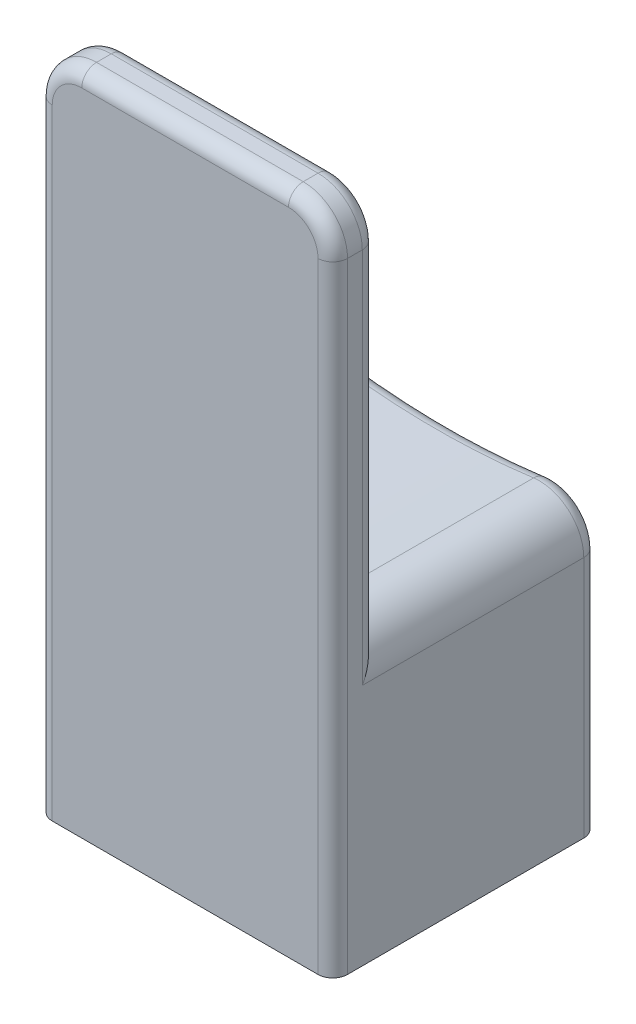
ISO-10303-21;
HEADER;
FILE_DESCRIPTION(('STEP AP214'),'2;1');
FILE_NAME('part.step','',(''),(''),'','','');
FILE_SCHEMA(('AUTOMOTIVE_DESIGN { 1 0 10303 214 1 1 1 1 }'));
ENDSEC;
DATA;
#1=APPLICATION_CONTEXT('core data for automotive mechanical design processes');
#2=APPLICATION_PROTOCOL_DEFINITION('international standard','automotive_design',2000,#1);
#3=PRODUCT_CONTEXT('',#1,'mechanical');
#4=PRODUCT('Part','Part','',(#3));
#5=PRODUCT_RELATED_PRODUCT_CATEGORY('part','',(#4));
#6=PRODUCT_DEFINITION_FORMATION('','',#4);
#7=PRODUCT_DEFINITION_CONTEXT('part definition',#1,'design');
#8=PRODUCT_DEFINITION('design','',#6,#7);
#9=PRODUCT_DEFINITION_SHAPE('','',#8);
#10=(LENGTH_UNIT() NAMED_UNIT(*) SI_UNIT(.MILLI.,.METRE.));
#11=(NAMED_UNIT(*) PLANE_ANGLE_UNIT() SI_UNIT($,.RADIAN.));
#12=(NAMED_UNIT(*) SI_UNIT($,.STERADIAN.) SOLID_ANGLE_UNIT());
#13=UNCERTAINTY_MEASURE_WITH_UNIT(LENGTH_MEASURE(1.E-05),#10,'distance_accuracy_value','');
#14=(GEOMETRIC_REPRESENTATION_CONTEXT(3) GLOBAL_UNCERTAINTY_ASSIGNED_CONTEXT((#13)) GLOBAL_UNIT_ASSIGNED_CONTEXT((#10,
#11,#12)) REPRESENTATION_CONTEXT('',''));
#15=CARTESIAN_POINT('',(0.,0.,0.));
#16=DIRECTION('',(0.,0.,1.));
#17=DIRECTION('',(1.,0.,0.));
#18=AXIS2_PLACEMENT_3D('',#15,#16,#17);
#19=CARTESIAN_POINT('',(0.,3.5,0.));
#20=DIRECTION('',(0.,-1.,0.));
#21=DIRECTION('',(0.,0.,-1.));
#22=AXIS2_PLACEMENT_3D('',#19,#20,#21);
#23=CYLINDRICAL_SURFACE('',#22,3.9);
#24=CARTESIAN_POINT('',(0.,3.5,0.));
#25=DIRECTION('',(0.,1.,0.));
#26=DIRECTION('',(0.,0.,1.));
#27=AXIS2_PLACEMENT_3D('',#24,#25,#26);
#28=CIRCLE('',#27,3.9);
#29=CARTESIAN_POINT('',(0.,3.5,3.9));
#30=VERTEX_POINT('',#29);
#31=EDGE_CURVE('E194',#30,#30,#28,.T.);
#32=ORIENTED_EDGE('',*,*,#31,.F.);
#33=EDGE_LOOP('',(#32));
#34=FACE_BOUND('',#33,.T.);
#35=CARTESIAN_POINT('',(0.,0.,0.));
#36=DIRECTION('',(0.,1.,0.));
#37=DIRECTION('',(0.,0.,1.));
#38=AXIS2_PLACEMENT_3D('',#35,#36,#37);
#39=CIRCLE('',#38,3.9);
#40=CARTESIAN_POINT('',(0.,0.,3.9));
#41=VERTEX_POINT('',#40);
#42=EDGE_CURVE('E197',#41,#41,#39,.T.);
#43=ORIENTED_EDGE('',*,*,#42,.T.);
#44=EDGE_LOOP('',(#43));
#45=FACE_BOUND('',#44,.T.);
#46=ADVANCED_FACE('F41',(#34,#45),#23,.T.);
#47=CARTESIAN_POINT('',(0.,0.,0.));
#48=DIRECTION('',(0.,1.,0.));
#49=DIRECTION('',(0.,0.,1.));
#50=AXIS2_PLACEMENT_3D('',#47,#48,#49);
#51=PLANE('',#50);
#52=ORIENTED_EDGE('',*,*,#42,.F.);
#53=EDGE_LOOP('',(#52));
#54=FACE_BOUND('',#53,.T.);
#55=ADVANCED_FACE('F325',(#54),#51,.F.);
#56=CARTESIAN_POINT('',(-10.,23.5,7.5));
#57=DIRECTION('',(1.,0.,0.));
#58=DIRECTION('',(0.,0.,-1.));
#59=AXIS2_PLACEMENT_3D('',#56,#57,#58);
#60=PLANE('',#59);
#61=DIRECTION('',(0.,0.,1.));
#62=VECTOR('',#61,1.);
#63=CARTESIAN_POINT('',(-10.,19.9540927094088,7.5));
#64=LINE('',#63,#62);
#65=CARTESIAN_POINT('',(-10.,19.9540927094088,8.5));
#66=VERTEX_POINT('',#65);
#67=CARTESIAN_POINT('',(-10.,19.9540927094088,-6.5));
#68=VERTEX_POINT('',#67);
#69=EDGE_CURVE('E203',#66,#68,#64,.F.);
#70=ORIENTED_EDGE('',*,*,#69,.T.);
#71=DIRECTION('',(0.,-1.,0.));
#72=VECTOR('',#71,1.);
#73=CARTESIAN_POINT('',(-10.,23.5,-6.5));
#74=LINE('',#73,#72);
#75=CARTESIAN_POINT('',(-10.,3.5,-6.5));
#76=VERTEX_POINT('',#75);
#77=EDGE_CURVE('E365',#68,#76,#74,.T.);
#78=ORIENTED_EDGE('',*,*,#77,.T.);
#79=DIRECTION('',(0.,0.,1.));
#80=VECTOR('',#79,1.);
#81=CARTESIAN_POINT('',(-10.,3.5,7.5));
#82=LINE('',#81,#80);
#83=CARTESIAN_POINT('',(-10.,3.5,9.5));
#84=VERTEX_POINT('',#83);
#85=EDGE_CURVE('E455',#76,#84,#82,.T.);
#86=ORIENTED_EDGE('',*,*,#85,.T.);
#87=DIRECTION('',(0.,-1.,0.));
#88=VECTOR('',#87,1.);
#89=CARTESIAN_POINT('',(-10.,23.5,9.5));
#90=LINE('',#89,#88);
#91=CARTESIAN_POINT('',(-10.,45.5,9.5));
#92=VERTEX_POINT('',#91);
#93=EDGE_CURVE('E248',#84,#92,#90,.F.);
#94=ORIENTED_EDGE('',*,*,#93,.T.);
#95=DIRECTION('',(0.,0.,-1.));
#96=VECTOR('',#95,1.);
#97=CARTESIAN_POINT('',(-10.,45.5,7.5));
#98=LINE('',#97,#96);
#99=CARTESIAN_POINT('',(-10.,45.5,8.5));
#100=VERTEX_POINT('',#99);
#101=EDGE_CURVE('E208',#92,#100,#98,.T.);
#102=ORIENTED_EDGE('',*,*,#101,.T.);
#103=DIRECTION('',(0.,-1.,0.));
#104=VECTOR('',#103,1.);
#105=CARTESIAN_POINT('',(-10.,19.9540927094088,8.5));
#106=LINE('',#105,#104);
#107=EDGE_CURVE('E245',#100,#66,#106,.T.);
#108=ORIENTED_EDGE('',*,*,#107,.T.);
#109=EDGE_LOOP('',(#70,#78,#86,#94,#102,#108));
#110=FACE_BOUND('',#109,.T.);
#111=ADVANCED_FACE('F331',(#110),#60,.F.);
#112=CARTESIAN_POINT('',(10.,23.5,7.5));
#113=DIRECTION('',(-1.,0.,0.));
#114=DIRECTION('',(0.,0.,1.));
#115=AXIS2_PLACEMENT_3D('',#112,#113,#114);
#116=PLANE('',#115);
#117=DIRECTION('',(0.,0.,-1.));
#118=VECTOR('',#117,1.);
#119=CARTESIAN_POINT('',(10.,3.5,7.5));
#120=LINE('',#119,#118);
#121=CARTESIAN_POINT('',(10.,3.5,9.5));
#122=VERTEX_POINT('',#121);
#123=CARTESIAN_POINT('',(10.,3.5,-6.5));
#124=VERTEX_POINT('',#123);
#125=EDGE_CURVE('E459',#122,#124,#120,.T.);
#126=ORIENTED_EDGE('',*,*,#125,.T.);
#127=DIRECTION('',(0.,-1.,0.));
#128=VECTOR('',#127,1.);
#129=CARTESIAN_POINT('',(10.,23.5,-6.5));
#130=LINE('',#129,#128);
#131=CARTESIAN_POINT('',(10.,19.9540927094088,-6.5));
#132=VERTEX_POINT('',#131);
#133=EDGE_CURVE('E65',#124,#132,#130,.F.);
#134=ORIENTED_EDGE('',*,*,#133,.T.);
#135=DIRECTION('',(0.,0.,1.));
#136=VECTOR('',#135,1.);
#137=CARTESIAN_POINT('',(10.,19.9540927094088,7.5));
#138=LINE('',#137,#136);
#139=CARTESIAN_POINT('',(10.,19.9540927094088,8.5));
#140=VERTEX_POINT('',#139);
#141=EDGE_CURVE('E206',#132,#140,#138,.T.);
#142=ORIENTED_EDGE('',*,*,#141,.T.);
#143=DIRECTION('',(0.,1.,0.));
#144=VECTOR('',#143,1.);
#145=CARTESIAN_POINT('',(10.,45.5,8.5));
#146=LINE('',#145,#144);
#147=CARTESIAN_POINT('',(10.,45.5,8.5));
#148=VERTEX_POINT('',#147);
#149=EDGE_CURVE('E231',#140,#148,#146,.T.);
#150=ORIENTED_EDGE('',*,*,#149,.T.);
#151=DIRECTION('',(0.,0.,-1.));
#152=VECTOR('',#151,1.);
#153=CARTESIAN_POINT('',(10.,45.5,7.5));
#154=LINE('',#153,#152);
#155=CARTESIAN_POINT('',(10.,45.5,9.5));
#156=VERTEX_POINT('',#155);
#157=EDGE_CURVE('E217',#148,#156,#154,.F.);
#158=ORIENTED_EDGE('',*,*,#157,.T.);
#159=DIRECTION('',(0.,1.,0.));
#160=VECTOR('',#159,1.);
#161=CARTESIAN_POINT('',(10.,23.5,9.5));
#162=LINE('',#161,#160);
#163=EDGE_CURVE('E234',#156,#122,#162,.F.);
#164=ORIENTED_EDGE('',*,*,#163,.T.);
#165=EDGE_LOOP('',(#126,#134,#142,#150,#158,#164));
#166=FACE_BOUND('',#165,.T.);
#167=ADVANCED_FACE('F350',(#166),#116,.F.);
#168=CARTESIAN_POINT('',(10.,23.5,-7.5));
#169=DIRECTION('',(0.,0.,1.));
#170=DIRECTION('',(1.,0.,0.));
#171=AXIS2_PLACEMENT_3D('',#168,#169,#170);
#172=PLANE('',#171);
#173=DIRECTION('',(-1.,0.,0.));
#174=VECTOR('',#173,1.);
#175=CARTESIAN_POINT('',(10.,3.5,-7.5));
#176=LINE('',#175,#174);
#177=CARTESIAN_POINT('',(9.,3.5,-7.5));
#178=VERTEX_POINT('',#177);
#179=CARTESIAN_POINT('',(-9.,3.5,-7.5));
#180=VERTEX_POINT('',#179);
#181=EDGE_CURVE('E463',#178,#180,#176,.T.);
#182=ORIENTED_EDGE('',*,*,#181,.T.);
#183=DIRECTION('',(0.,-1.,0.));
#184=VECTOR('',#183,1.);
#185=CARTESIAN_POINT('',(-9.,23.5,-7.5));
#186=LINE('',#185,#184);
#187=CARTESIAN_POINT('',(-9.,19.9540927094088,-7.5));
#188=VERTEX_POINT('',#187);
#189=EDGE_CURVE('E399',#180,#188,#186,.F.);
#190=ORIENTED_EDGE('',*,*,#189,.T.);
#191=CARTESIAN_POINT('',(-7.,19.9540927094088,-7.5));
#192=DIRECTION('',(0.,0.,1.));
#193=DIRECTION('',(1.,0.,0.));
#194=AXIS2_PLACEMENT_3D('',#191,#192,#193);
#195=CIRCLE('',#194,2.);
#196=CARTESIAN_POINT('',(-6.73584905660377,21.9365720356825,-7.5));
#197=VERTEX_POINT('',#196);
#198=EDGE_CURVE('E377',#188,#197,#195,.F.);
#199=ORIENTED_EDGE('',*,*,#198,.T.);
#200=CARTESIAN_POINT('',(0.,72.4897948556636,-7.5));
#201=DIRECTION('',(0.,0.,1.));
#202=DIRECTION('',(1.,0.,0.));
#203=AXIS2_PLACEMENT_3D('',#200,#201,#202);
#204=CIRCLE('',#203,51.);
#205=CARTESIAN_POINT('',(6.73584905660377,21.9365720356825,-7.5));
#206=VERTEX_POINT('',#205);
#207=EDGE_CURVE('E392',#197,#206,#204,.T.);
#208=ORIENTED_EDGE('',*,*,#207,.T.);
#209=CARTESIAN_POINT('',(7.,19.9540927094088,-7.5));
#210=DIRECTION('',(0.,0.,1.));
#211=DIRECTION('',(1.,0.,0.));
#212=AXIS2_PLACEMENT_3D('',#209,#210,#211);
#213=CIRCLE('',#212,2.);
#214=CARTESIAN_POINT('',(9.,19.9540927094088,-7.5));
#215=VERTEX_POINT('',#214);
#216=EDGE_CURVE('E394',#206,#215,#213,.F.);
#217=ORIENTED_EDGE('',*,*,#216,.T.);
#218=DIRECTION('',(0.,-1.,0.));
#219=VECTOR('',#218,1.);
#220=CARTESIAN_POINT('',(9.,23.5,-7.5));
#221=LINE('',#220,#219);
#222=EDGE_CURVE('E396',#215,#178,#221,.T.);
#223=ORIENTED_EDGE('',*,*,#222,.T.);
#224=EDGE_LOOP('',(#182,#190,#199,#208,#217,#223));
#225=FACE_BOUND('',#224,.T.);
#226=ADVANCED_FACE('F344',(#225),#172,.F.);
#227=CARTESIAN_POINT('',(0.,3.5,0.));
#228=DIRECTION('',(0.,1.,0.));
#229=DIRECTION('',(0.,0.,1.));
#230=AXIS2_PLACEMENT_3D('',#227,#228,#229);
#231=PLANE('',#230);
#232=ORIENTED_EDGE('',*,*,#31,.T.);
#233=EDGE_LOOP('',(#232));
#234=FACE_BOUND('',#233,.T.);
#235=ORIENTED_EDGE('',*,*,#85,.F.);
#236=CARTESIAN_POINT('',(-9.,3.5,-6.5));
#237=DIRECTION('',(0.,1.,0.));
#238=DIRECTION('',(0.,0.,1.));
#239=AXIS2_PLACEMENT_3D('',#236,#237,#238);
#240=CIRCLE('',#239,1.);
#241=EDGE_CURVE('E383',#76,#180,#240,.F.);
#242=ORIENTED_EDGE('',*,*,#241,.T.);
#243=ORIENTED_EDGE('',*,*,#181,.F.);
#244=CARTESIAN_POINT('',(9.,3.5,-6.5));
#245=DIRECTION('',(0.,1.,0.));
#246=DIRECTION('',(0.,0.,1.));
#247=AXIS2_PLACEMENT_3D('',#244,#245,#246);
#248=CIRCLE('',#247,1.);
#249=EDGE_CURVE('E384',#178,#124,#248,.F.);
#250=ORIENTED_EDGE('',*,*,#249,.T.);
#251=ORIENTED_EDGE('',*,*,#125,.F.);
#252=CARTESIAN_POINT('',(9.,3.5,9.5));
#253=DIRECTION('',(0.,1.,0.));
#254=DIRECTION('',(0.,0.,1.));
#255=AXIS2_PLACEMENT_3D('',#252,#253,#254);
#256=CIRCLE('',#255,1.);
#257=CARTESIAN_POINT('',(9.,3.5,10.5));
#258=VERTEX_POINT('',#257);
#259=EDGE_CURVE('E239',#122,#258,#256,.F.);
#260=ORIENTED_EDGE('',*,*,#259,.T.);
#261=DIRECTION('',(1.,0.,0.));
#262=VECTOR('',#261,1.);
#263=CARTESIAN_POINT('',(-10.,3.5,10.5));
#264=LINE('',#263,#262);
#265=CARTESIAN_POINT('',(-9.,3.5,10.5));
#266=VERTEX_POINT('',#265);
#267=EDGE_CURVE('E450',#266,#258,#264,.T.);
#268=ORIENTED_EDGE('',*,*,#267,.F.);
#269=CARTESIAN_POINT('',(-9.,3.5,9.5));
#270=DIRECTION('',(0.,1.,0.));
#271=DIRECTION('',(0.,0.,1.));
#272=AXIS2_PLACEMENT_3D('',#269,#270,#271);
#273=CIRCLE('',#272,1.);
#274=EDGE_CURVE('E236',#266,#84,#273,.F.);
#275=ORIENTED_EDGE('',*,*,#274,.T.);
#276=EDGE_LOOP('',(#235,#242,#243,#250,#251,#260,#268,#275));
#277=FACE_BOUND('',#276,.T.);
#278=ADVANCED_FACE('F338',(#234,#277),#231,.F.);
#279=CARTESIAN_POINT('',(0.,72.4897948556636,7.5));
#280=DIRECTION('',(0.,0.,1.));
#281=DIRECTION('',(0.,-1.,0.));
#282=AXIS2_PLACEMENT_3D('',#279,#280,#281);
#283=CYLINDRICAL_SURFACE('',#282,50.);
#284=DIRECTION('',(0.,0.,1.));
#285=VECTOR('',#284,1.);
#286=CARTESIAN_POINT('',(6.60377358490566,22.9278116988194,7.5));
#287=LINE('',#286,#285);
#288=CARTESIAN_POINT('',(6.60377358490566,22.9278116988194,7.5));
#289=VERTEX_POINT('',#288);
#290=CARTESIAN_POINT('',(6.60377358490566,22.9278116988194,-6.5));
#291=VERTEX_POINT('',#290);
#292=EDGE_CURVE('E186',#289,#291,#287,.F.);
#293=ORIENTED_EDGE('',*,*,#292,.T.);
#294=CARTESIAN_POINT('',(0.,72.4897948556636,-6.5));
#295=DIRECTION('',(0.,0.,1.));
#296=DIRECTION('',(1.,0.,0.));
#297=AXIS2_PLACEMENT_3D('',#294,#295,#296);
#298=CIRCLE('',#297,50.);
#299=CARTESIAN_POINT('',(-6.60377358490566,22.9278116988194,-6.5));
#300=VERTEX_POINT('',#299);
#301=EDGE_CURVE('E11',#291,#300,#298,.F.);
#302=ORIENTED_EDGE('',*,*,#301,.T.);
#303=DIRECTION('',(0.,0.,1.));
#304=VECTOR('',#303,1.);
#305=CARTESIAN_POINT('',(-6.60377358490566,22.9278116988194,7.5));
#306=LINE('',#305,#304);
#307=CARTESIAN_POINT('',(-6.60377358490566,22.9278116988194,7.5));
#308=VERTEX_POINT('',#307);
#309=EDGE_CURVE('E184',#300,#308,#306,.T.);
#310=ORIENTED_EDGE('',*,*,#309,.T.);
#311=CARTESIAN_POINT('',(0.,72.4897948556636,7.5));
#312=DIRECTION('',(0.,0.,-1.));
#313=DIRECTION('',(-1.,0.,0.));
#314=AXIS2_PLACEMENT_3D('',#311,#312,#313);
#315=CIRCLE('',#314,50.);
#316=EDGE_CURVE('E178',#289,#308,#315,.T.);
#317=ORIENTED_EDGE('',*,*,#316,.F.);
#318=EDGE_LOOP('',(#293,#302,#310,#317));
#319=FACE_BOUND('',#318,.T.);
#320=ADVANCED_FACE('F191',(#319),#283,.F.);
#321=CARTESIAN_POINT('',(-7.,19.9540927094088,7.5));
#322=DIRECTION('',(0.,0.,1.));
#323=DIRECTION('',(0.,-1.,0.));
#324=AXIS2_PLACEMENT_3D('',#321,#322,#323);
#325=CYLINDRICAL_SURFACE('',#324,3.);
#326=ORIENTED_EDGE('',*,*,#309,.F.);
#327=CARTESIAN_POINT('',(-7.,19.9540927094088,-6.5));
#328=DIRECTION('',(0.,0.,1.));
#329=DIRECTION('',(1.,0.,0.));
#330=AXIS2_PLACEMENT_3D('',#327,#328,#329);
#331=CIRCLE('',#330,3.);
#332=EDGE_CURVE('E376',#300,#68,#331,.T.);
#333=ORIENTED_EDGE('',*,*,#332,.T.);
#334=ORIENTED_EDGE('',*,*,#69,.F.);
#335=CARTESIAN_POINT('',(-9.,22.1901606869086,7.5));
#336=CARTESIAN_POINT('',(-9.03165787721728,22.1618500031163,7.50000455551072));
#337=CARTESIAN_POINT('',(-9.06268744437701,22.1328812910441,7.50150263052097));
#338=CARTESIAN_POINT('',(-9.12333217250572,22.0738201256156,7.50716698518481));
#339=CARTESIAN_POINT('',(-9.15294908113599,22.0437291474012,7.51132987097531));
#340=CARTESIAN_POINT('',(-9.23912627426627,21.9524128567582,7.52726423180946));
#341=CARTESIAN_POINT('',(-9.2934948471067,21.8897115444338,7.5424913092058));
#342=CARTESIAN_POINT('',(-9.4295613572291,21.7192372109462,7.592437017818));
#343=CARTESIAN_POINT('',(-9.50574463309726,21.6089186549048,7.63338882471227));
#344=CARTESIAN_POINT('',(-9.64123727792318,21.3828650722906,7.7281873059139));
#345=CARTESIAN_POINT('',(-9.70043791408908,21.2671004353232,7.78211317833401));
#346=CARTESIAN_POINT('',(-9.78766892394679,21.066377876123,7.88145907332465));
#347=CARTESIAN_POINT('',(-9.81976668088903,20.9821411768445,7.92486125147374));
#348=CARTESIAN_POINT('',(-9.87593200214764,20.8125798285562,8.01466433611523));
#349=CARTESIAN_POINT('',(-9.89999551480867,20.7272546530795,8.06106674158024));
#350=CARTESIAN_POINT('',(-9.96040290764697,20.4706547513828,8.20303658057048));
#351=CARTESIAN_POINT('',(-9.98521023345619,20.2981743489196,8.30166601961666));
#352=CARTESIAN_POINT('',(-9.99818404629851,20.0716358166408,8.43214230188699));
#353=CARTESIAN_POINT('',(-9.99981416628266,20.0176114905362,8.46332773518349));
#354=CARTESIAN_POINT('',(-9.99999499809153,19.9604172949114,8.49634849414383));
#355=CARTESIAN_POINT('',(-9.99999999781967,19.957255015599,8.49817423684657));
#356=CARTESIAN_POINT('',(-10.,19.9540927094088,8.5));
#357=B_SPLINE_CURVE_WITH_KNOTS('',3,(#335,#336,#337,#338,#339,#340,#341,#342,#343,#344,#345,
#346,#347,#348,#349,#350,#351,#352,#353,#354,#355,#356),.UNSPECIFIED.,.F.,.F.,(4,2,2,2,2,2,2,2,
2,2,4),(0.,0.127328124372186,0.254494407314567,0.506902758847989,0.925154347494174,
1.34602692875662,1.64578712718784,1.94569826663475,2.54344782717995,2.7306215879237,
2.74157604934411),.UNSPECIFIED.);
#358=CARTESIAN_POINT('',(-9.,22.1901606869086,7.5));
#359=VERTEX_POINT('',#358);
#360=EDGE_CURVE('E275',#66,#359,#357,.F.);
#361=ORIENTED_EDGE('',*,*,#360,.T.);
#362=CARTESIAN_POINT('',(-7.,19.9540927094088,7.5));
#363=DIRECTION('',(0.,0.,-1.));
#364=DIRECTION('',(-1.,0.,0.));
#365=AXIS2_PLACEMENT_3D('',#362,#363,#364);
#366=CIRCLE('',#365,3.);
#367=EDGE_CURVE('E183',#308,#359,#366,.F.);
#368=ORIENTED_EDGE('',*,*,#367,.F.);
#369=EDGE_LOOP('',(#326,#333,#334,#361,#368));
#370=FACE_BOUND('',#369,.T.);
#371=ADVANCED_FACE('F291',(#370),#325,.T.);
#372=CARTESIAN_POINT('',(7.,19.9540927094088,7.5));
#373=DIRECTION('',(0.,0.,1.));
#374=DIRECTION('',(0.,-1.,0.));
#375=AXIS2_PLACEMENT_3D('',#372,#373,#374);
#376=CYLINDRICAL_SURFACE('',#375,3.);
#377=ORIENTED_EDGE('',*,*,#141,.F.);
#378=CARTESIAN_POINT('',(7.,19.9540927094088,-6.5));
#379=DIRECTION('',(0.,0.,1.));
#380=DIRECTION('',(1.,0.,0.));
#381=AXIS2_PLACEMENT_3D('',#378,#379,#380);
#382=CIRCLE('',#381,3.);
#383=EDGE_CURVE('E50',#132,#291,#382,.T.);
#384=ORIENTED_EDGE('',*,*,#383,.T.);
#385=ORIENTED_EDGE('',*,*,#292,.F.);
#386=CARTESIAN_POINT('',(7.,19.9540927094088,7.5));
#387=DIRECTION('',(0.,0.,-1.));
#388=DIRECTION('',(-1.,0.,0.));
#389=AXIS2_PLACEMENT_3D('',#386,#387,#388);
#390=CIRCLE('',#389,3.);
#391=CARTESIAN_POINT('',(9.,22.1901606869086,7.5));
#392=VERTEX_POINT('',#391);
#393=EDGE_CURVE('E174',#392,#289,#390,.F.);
#394=ORIENTED_EDGE('',*,*,#393,.F.);
#395=CARTESIAN_POINT('',(9.,22.1901606869086,7.5));
#396=CARTESIAN_POINT('',(9.03165787721728,22.1618500031163,7.50000455551072));
#397=CARTESIAN_POINT('',(9.06268744437701,22.1328812910441,7.50150263052097));
#398=CARTESIAN_POINT('',(9.12333217250572,22.0738201256156,7.50716698518481));
#399=CARTESIAN_POINT('',(9.15294908113599,22.0437291474012,7.51132987097531));
#400=CARTESIAN_POINT('',(9.23912627426627,21.9524128567582,7.52726423180946));
#401=CARTESIAN_POINT('',(9.2934948471067,21.8897115444338,7.5424913092058));
#402=CARTESIAN_POINT('',(9.4295613572291,21.7192372109462,7.592437017818));
#403=CARTESIAN_POINT('',(9.50574463309726,21.6089186549048,7.63338882471227));
#404=CARTESIAN_POINT('',(9.64123727792318,21.3828650722906,7.7281873059139));
#405=CARTESIAN_POINT('',(9.70043791408908,21.2671004353232,7.78211317833401));
#406=CARTESIAN_POINT('',(9.78766892394679,21.066377876123,7.88145907332465));
#407=CARTESIAN_POINT('',(9.81976668088903,20.9821411768445,7.92486125147374));
#408=CARTESIAN_POINT('',(9.87593200214764,20.8125798285562,8.01466433611523));
#409=CARTESIAN_POINT('',(9.89999551480867,20.7272546530795,8.06106674158024));
#410=CARTESIAN_POINT('',(9.96040290764697,20.4706547513828,8.20303658057048));
#411=CARTESIAN_POINT('',(9.98521023345619,20.2981743489196,8.30166601961666));
#412=CARTESIAN_POINT('',(9.99818404629851,20.0716358166408,8.43214230188699));
#413=CARTESIAN_POINT('',(9.99981416628266,20.0176114905362,8.46332773518349));
#414=CARTESIAN_POINT('',(9.99999499809153,19.9604172949114,8.49634849414383));
#415=CARTESIAN_POINT('',(9.99999999781967,19.957255015599,8.49817423684657));
#416=CARTESIAN_POINT('',(10.,19.9540927094088,8.5));
#417=B_SPLINE_CURVE_WITH_KNOTS('',3,(#395,#396,#397,#398,#399,#400,#401,#402,#403,#404,#405,
#406,#407,#408,#409,#410,#411,#412,#413,#414,#415,#416),.UNSPECIFIED.,.F.,.F.,(4,2,2,2,2,2,2,2,
2,2,4),(0.,0.127328124372186,0.254494407314567,0.506902758847989,0.925154347494174,
1.34602692875662,1.64578712718784,1.94569826663475,2.54344782717995,2.7306215879237,
2.74157604934411),.UNSPECIFIED.);
#418=EDGE_CURVE('E267',#392,#140,#417,.T.);
#419=ORIENTED_EDGE('',*,*,#418,.T.);
#420=EDGE_LOOP('',(#377,#384,#385,#394,#419));
#421=FACE_BOUND('',#420,.T.);
#422=ADVANCED_FACE('F187',(#421),#376,.T.);
#423=CARTESIAN_POINT('',(-10.,48.5,10.5));
#424=DIRECTION('',(0.,-1.,0.));
#425=DIRECTION('',(0.,0.,-1.));
#426=AXIS2_PLACEMENT_3D('',#423,#424,#425);
#427=PLANE('',#426);
#428=DIRECTION('',(0.,0.,-1.));
#429=VECTOR('',#428,1.);
#430=CARTESIAN_POINT('',(-7.,48.5,10.5));
#431=LINE('',#430,#429);
#432=CARTESIAN_POINT('',(-7.,48.5,8.5));
#433=VERTEX_POINT('',#432);
#434=CARTESIAN_POINT('',(-7.,48.5,9.5));
#435=VERTEX_POINT('',#434);
#436=EDGE_CURVE('E214',#433,#435,#431,.F.);
#437=ORIENTED_EDGE('',*,*,#436,.T.);
#438=DIRECTION('',(-1.,0.,0.));
#439=VECTOR('',#438,1.);
#440=CARTESIAN_POINT('',(-10.,48.5,9.5));
#441=LINE('',#440,#439);
#442=CARTESIAN_POINT('',(7.,48.5,9.5));
#443=VERTEX_POINT('',#442);
#444=EDGE_CURVE('E265',#435,#443,#441,.F.);
#445=ORIENTED_EDGE('',*,*,#444,.T.);
#446=DIRECTION('',(0.,0.,-1.));
#447=VECTOR('',#446,1.);
#448=CARTESIAN_POINT('',(7.,48.5,10.5));
#449=LINE('',#448,#447);
#450=CARTESIAN_POINT('',(7.,48.5,8.5));
#451=VERTEX_POINT('',#450);
#452=EDGE_CURVE('E211',#443,#451,#449,.T.);
#453=ORIENTED_EDGE('',*,*,#452,.T.);
#454=DIRECTION('',(-1.,0.,0.));
#455=VECTOR('',#454,1.);
#456=CARTESIAN_POINT('',(-7.,48.5,8.5));
#457=LINE('',#456,#455);
#458=EDGE_CURVE('E263',#451,#433,#457,.T.);
#459=ORIENTED_EDGE('',*,*,#458,.T.);
#460=EDGE_LOOP('',(#437,#445,#453,#459));
#461=FACE_BOUND('',#460,.T.);
#462=ADVANCED_FACE('F290',(#461),#427,.F.);
#463=CARTESIAN_POINT('',(0.,0.,10.5));
#464=DIRECTION('',(0.,0.,-1.));
#465=DIRECTION('',(-1.,0.,0.));
#466=AXIS2_PLACEMENT_3D('',#463,#464,#465);
#467=PLANE('',#466);
#468=ORIENTED_EDGE('',*,*,#267,.T.);
#469=DIRECTION('',(0.,1.,0.));
#470=VECTOR('',#469,1.);
#471=CARTESIAN_POINT('',(9.,0.,10.5));
#472=LINE('',#471,#470);
#473=CARTESIAN_POINT('',(9.,45.5,10.5));
#474=VERTEX_POINT('',#473);
#475=EDGE_CURVE('E228',#258,#474,#472,.T.);
#476=ORIENTED_EDGE('',*,*,#475,.T.);
#477=CARTESIAN_POINT('',(7.,45.5,10.5));
#478=DIRECTION('',(0.,0.,-1.));
#479=DIRECTION('',(-1.,0.,0.));
#480=AXIS2_PLACEMENT_3D('',#477,#478,#479);
#481=CIRCLE('',#480,2.);
#482=CARTESIAN_POINT('',(7.,47.5,10.5));
#483=VERTEX_POINT('',#482);
#484=EDGE_CURVE('E226',#474,#483,#481,.F.);
#485=ORIENTED_EDGE('',*,*,#484,.T.);
#486=DIRECTION('',(-1.,0.,0.));
#487=VECTOR('',#486,1.);
#488=CARTESIAN_POINT('',(0.,47.5,10.5));
#489=LINE('',#488,#487);
#490=CARTESIAN_POINT('',(-7.,47.5,10.5));
#491=VERTEX_POINT('',#490);
#492=EDGE_CURVE('E220',#483,#491,#489,.T.);
#493=ORIENTED_EDGE('',*,*,#492,.T.);
#494=CARTESIAN_POINT('',(-7.,45.5,10.5));
#495=DIRECTION('',(0.,0.,-1.));
#496=DIRECTION('',(-1.,0.,0.));
#497=AXIS2_PLACEMENT_3D('',#494,#495,#496);
#498=CIRCLE('',#497,2.);
#499=CARTESIAN_POINT('',(-9.,45.5,10.5));
#500=VERTEX_POINT('',#499);
#501=EDGE_CURVE('E222',#491,#500,#498,.F.);
#502=ORIENTED_EDGE('',*,*,#501,.T.);
#503=DIRECTION('',(0.,-1.,0.));
#504=VECTOR('',#503,1.);
#505=CARTESIAN_POINT('',(-9.,0.,10.5));
#506=LINE('',#505,#504);
#507=EDGE_CURVE('E224',#500,#266,#506,.T.);
#508=ORIENTED_EDGE('',*,*,#507,.T.);
#509=EDGE_LOOP('',(#468,#476,#485,#493,#502,#508));
#510=FACE_BOUND('',#509,.T.);
#511=ADVANCED_FACE('F487',(#510),#467,.F.);
#512=CARTESIAN_POINT('',(0.,0.,7.5));
#513=DIRECTION('',(0.,0.,-1.));
#514=DIRECTION('',(-1.,0.,0.));
#515=AXIS2_PLACEMENT_3D('',#512,#513,#514);
#516=PLANE('',#515);
#517=CARTESIAN_POINT('',(7.,45.5,7.5));
#518=DIRECTION('',(0.,0.,-1.));
#519=DIRECTION('',(-1.,0.,0.));
#520=AXIS2_PLACEMENT_3D('',#517,#518,#519);
#521=CIRCLE('',#520,2.);
#522=CARTESIAN_POINT('',(7.,47.5,7.5));
#523=VERTEX_POINT('',#522);
#524=CARTESIAN_POINT('',(9.,45.5,7.5));
#525=VERTEX_POINT('',#524);
#526=EDGE_CURVE('E260',#523,#525,#521,.T.);
#527=ORIENTED_EDGE('',*,*,#526,.T.);
#528=DIRECTION('',(0.,1.,0.));
#529=VECTOR('',#528,1.);
#530=CARTESIAN_POINT('',(9.,19.9540927094088,7.5));
#531=LINE('',#530,#529);
#532=EDGE_CURVE('E180',#525,#392,#531,.F.);
#533=ORIENTED_EDGE('',*,*,#532,.T.);
#534=ORIENTED_EDGE('',*,*,#393,.T.);
#535=ORIENTED_EDGE('',*,*,#316,.T.);
#536=ORIENTED_EDGE('',*,*,#367,.T.);
#537=DIRECTION('',(0.,-1.,0.));
#538=VECTOR('',#537,1.);
#539=CARTESIAN_POINT('',(-9.,45.5,7.5));
#540=LINE('',#539,#538);
#541=CARTESIAN_POINT('',(-9.,45.5,7.5));
#542=VERTEX_POINT('',#541);
#543=EDGE_CURVE('E258',#359,#542,#540,.F.);
#544=ORIENTED_EDGE('',*,*,#543,.T.);
#545=CARTESIAN_POINT('',(-7.,45.5,7.5));
#546=DIRECTION('',(0.,0.,-1.));
#547=DIRECTION('',(-1.,0.,0.));
#548=AXIS2_PLACEMENT_3D('',#545,#546,#547);
#549=CIRCLE('',#548,2.);
#550=CARTESIAN_POINT('',(-7.,47.5,7.5));
#551=VERTEX_POINT('',#550);
#552=EDGE_CURVE('E256',#542,#551,#549,.T.);
#553=ORIENTED_EDGE('',*,*,#552,.T.);
#554=DIRECTION('',(-1.,0.,0.));
#555=VECTOR('',#554,1.);
#556=CARTESIAN_POINT('',(7.,47.5,7.5));
#557=LINE('',#556,#555);
#558=EDGE_CURVE('E254',#551,#523,#557,.F.);
#559=ORIENTED_EDGE('',*,*,#558,.T.);
#560=EDGE_LOOP('',(#527,#533,#534,#535,#536,#544,#553,#559));
#561=FACE_BOUND('',#560,.T.);
#562=ADVANCED_FACE('F175',(#561),#516,.T.);
#563=CARTESIAN_POINT('',(-7.,45.5,7.5));
#564=DIRECTION('',(0.,0.,-1.));
#565=DIRECTION('',(-1.,0.,0.));
#566=AXIS2_PLACEMENT_3D('',#563,#564,#565);
#567=CYLINDRICAL_SURFACE('',#566,3.);
#568=ORIENTED_EDGE('',*,*,#101,.F.);
#569=CARTESIAN_POINT('',(-7.,45.5,9.5));
#570=DIRECTION('',(0.,0.,-1.));
#571=DIRECTION('',(-1.,0.,0.));
#572=AXIS2_PLACEMENT_3D('',#569,#570,#571);
#573=CIRCLE('',#572,3.);
#574=EDGE_CURVE('E252',#92,#435,#573,.T.);
#575=ORIENTED_EDGE('',*,*,#574,.T.);
#576=ORIENTED_EDGE('',*,*,#436,.F.);
#577=CARTESIAN_POINT('',(-7.,45.5,8.5));
#578=DIRECTION('',(0.,0.,-1.));
#579=DIRECTION('',(-1.,0.,0.));
#580=AXIS2_PLACEMENT_3D('',#577,#578,#579);
#581=CIRCLE('',#580,3.);
#582=EDGE_CURVE('E250',#433,#100,#581,.F.);
#583=ORIENTED_EDGE('',*,*,#582,.T.);
#584=EDGE_LOOP('',(#568,#575,#576,#583));
#585=FACE_BOUND('',#584,.T.);
#586=ADVANCED_FACE('F294',(#585),#567,.T.);
#587=CARTESIAN_POINT('',(7.,45.5,10.5));
#588=DIRECTION('',(0.,0.,-1.));
#589=DIRECTION('',(-1.,0.,0.));
#590=AXIS2_PLACEMENT_3D('',#587,#588,#589);
#591=CYLINDRICAL_SURFACE('',#590,3.);
#592=ORIENTED_EDGE('',*,*,#452,.F.);
#593=CARTESIAN_POINT('',(7.,45.5,9.5));
#594=DIRECTION('',(0.,0.,-1.));
#595=DIRECTION('',(-1.,0.,0.));
#596=AXIS2_PLACEMENT_3D('',#593,#594,#595);
#597=CIRCLE('',#596,3.);
#598=EDGE_CURVE('E243',#443,#156,#597,.T.);
#599=ORIENTED_EDGE('',*,*,#598,.T.);
#600=ORIENTED_EDGE('',*,*,#157,.F.);
#601=CARTESIAN_POINT('',(7.,45.5,8.5));
#602=DIRECTION('',(0.,0.,-1.));
#603=DIRECTION('',(-1.,0.,0.));
#604=AXIS2_PLACEMENT_3D('',#601,#602,#603);
#605=CIRCLE('',#604,3.);
#606=EDGE_CURVE('E241',#148,#451,#605,.F.);
#607=ORIENTED_EDGE('',*,*,#606,.T.);
#608=EDGE_LOOP('',(#592,#599,#600,#607));
#609=FACE_BOUND('',#608,.T.);
#610=ADVANCED_FACE('F297',(#609),#591,.T.);
#611=CARTESIAN_POINT('',(-9.,0.,9.5));
#612=DIRECTION('',(0.,-1.,0.));
#613=DIRECTION('',(0.,0.,-1.));
#614=AXIS2_PLACEMENT_3D('',#611,#612,#613);
#615=CYLINDRICAL_SURFACE('',#614,1.);
#616=ORIENTED_EDGE('',*,*,#274,.F.);
#617=ORIENTED_EDGE('',*,*,#507,.F.);
#618=CARTESIAN_POINT('',(-9.,45.5,9.5));
#619=DIRECTION('',(0.,1.,0.));
#620=DIRECTION('',(0.,0.,1.));
#621=AXIS2_PLACEMENT_3D('',#618,#619,#620);
#622=CIRCLE('',#621,1.);
#623=EDGE_CURVE('E424',#92,#500,#622,.T.);
#624=ORIENTED_EDGE('',*,*,#623,.F.);
#625=ORIENTED_EDGE('',*,*,#93,.F.);
#626=EDGE_LOOP('',(#616,#617,#624,#625));
#627=FACE_BOUND('',#626,.T.);
#628=ADVANCED_FACE('F301',(#627),#615,.T.);
#629=CARTESIAN_POINT('',(-7.,45.5,9.5));
#630=DIRECTION('',(0.,0.,-1.));
#631=DIRECTION('',(-1.,0.,0.));
#632=AXIS2_PLACEMENT_3D('',#629,#630,#631);
#633=TOROIDAL_SURFACE('',#632,2.,1.);
#634=ORIENTED_EDGE('',*,*,#623,.T.);
#635=ORIENTED_EDGE('',*,*,#501,.F.);
#636=CARTESIAN_POINT('',(-7.,47.5,9.5));
#637=DIRECTION('',(1.,0.,0.));
#638=DIRECTION('',(0.,0.,-1.));
#639=AXIS2_PLACEMENT_3D('',#636,#637,#638);
#640=CIRCLE('',#639,1.);
#641=EDGE_CURVE('E443',#435,#491,#640,.T.);
#642=ORIENTED_EDGE('',*,*,#641,.F.);
#643=ORIENTED_EDGE('',*,*,#574,.F.);
#644=EDGE_LOOP('',(#634,#635,#642,#643));
#645=FACE_BOUND('',#644,.T.);
#646=ADVANCED_FACE('F315',(#645),#633,.T.);
#647=CARTESIAN_POINT('',(0.,47.5,9.5));
#648=DIRECTION('',(-1.,0.,0.));
#649=DIRECTION('',(0.,0.,1.));
#650=AXIS2_PLACEMENT_3D('',#647,#648,#649);
#651=CYLINDRICAL_SURFACE('',#650,1.);
#652=ORIENTED_EDGE('',*,*,#641,.T.);
#653=ORIENTED_EDGE('',*,*,#492,.F.);
#654=CARTESIAN_POINT('',(7.,47.5,9.5));
#655=DIRECTION('',(1.,0.,0.));
#656=DIRECTION('',(0.,0.,-1.));
#657=AXIS2_PLACEMENT_3D('',#654,#655,#656);
#658=CIRCLE('',#657,1.);
#659=EDGE_CURVE('E437',#443,#483,#658,.T.);
#660=ORIENTED_EDGE('',*,*,#659,.F.);
#661=ORIENTED_EDGE('',*,*,#444,.F.);
#662=EDGE_LOOP('',(#652,#653,#660,#661));
#663=FACE_BOUND('',#662,.T.);
#664=ADVANCED_FACE('F311',(#663),#651,.T.);
#665=CARTESIAN_POINT('',(7.,45.5,9.5));
#666=DIRECTION('',(0.,0.,-1.));
#667=DIRECTION('',(-1.,0.,0.));
#668=AXIS2_PLACEMENT_3D('',#665,#666,#667);
#669=TOROIDAL_SURFACE('',#668,2.,1.);
#670=ORIENTED_EDGE('',*,*,#659,.T.);
#671=ORIENTED_EDGE('',*,*,#484,.F.);
#672=CARTESIAN_POINT('',(9.,45.5,9.5));
#673=DIRECTION('',(0.,-1.,0.));
#674=DIRECTION('',(0.,0.,-1.));
#675=AXIS2_PLACEMENT_3D('',#672,#673,#674);
#676=CIRCLE('',#675,1.);
#677=EDGE_CURVE('E432',#156,#474,#676,.T.);
#678=ORIENTED_EDGE('',*,*,#677,.F.);
#679=ORIENTED_EDGE('',*,*,#598,.F.);
#680=EDGE_LOOP('',(#670,#671,#678,#679));
#681=FACE_BOUND('',#680,.T.);
#682=ADVANCED_FACE('F307',(#681),#669,.T.);
#683=CARTESIAN_POINT('',(9.,0.,9.5));
#684=DIRECTION('',(0.,1.,0.));
#685=DIRECTION('',(0.,0.,1.));
#686=AXIS2_PLACEMENT_3D('',#683,#684,#685);
#687=CYLINDRICAL_SURFACE('',#686,1.);
#688=ORIENTED_EDGE('',*,*,#259,.F.);
#689=ORIENTED_EDGE('',*,*,#163,.F.);
#690=ORIENTED_EDGE('',*,*,#677,.T.);
#691=ORIENTED_EDGE('',*,*,#475,.F.);
#692=EDGE_LOOP('',(#688,#689,#690,#691));
#693=FACE_BOUND('',#692,.T.);
#694=ADVANCED_FACE('F303',(#693),#687,.T.);
#695=CARTESIAN_POINT('',(-9.,23.5,8.5));
#696=DIRECTION('',(0.,1.,0.));
#697=DIRECTION('',(0.,0.,1.));
#698=AXIS2_PLACEMENT_3D('',#695,#696,#697);
#699=CYLINDRICAL_SURFACE('',#698,1.);
#700=ORIENTED_EDGE('',*,*,#360,.F.);
#701=ORIENTED_EDGE('',*,*,#107,.F.);
#702=CARTESIAN_POINT('',(-9.,45.5,8.5));
#703=DIRECTION('',(0.,1.,0.));
#704=DIRECTION('',(0.,0.,1.));
#705=AXIS2_PLACEMENT_3D('',#702,#703,#704);
#706=CIRCLE('',#705,1.);
#707=EDGE_CURVE('E388',#542,#100,#706,.T.);
#708=ORIENTED_EDGE('',*,*,#707,.F.);
#709=ORIENTED_EDGE('',*,*,#543,.F.);
#710=EDGE_LOOP('',(#700,#701,#708,#709));
#711=FACE_BOUND('',#710,.T.);
#712=ADVANCED_FACE('F306',(#711),#699,.T.);
#713=CARTESIAN_POINT('',(-7.,45.5,8.5));
#714=DIRECTION('',(0.,0.,-1.));
#715=DIRECTION('',(-1.,0.,0.));
#716=AXIS2_PLACEMENT_3D('',#713,#714,#715);
#717=TOROIDAL_SURFACE('',#716,2.,1.);
#718=ORIENTED_EDGE('',*,*,#707,.T.);
#719=ORIENTED_EDGE('',*,*,#582,.F.);
#720=CARTESIAN_POINT('',(-7.,47.5,8.5));
#721=DIRECTION('',(1.,0.,0.));
#722=DIRECTION('',(0.,0.,-1.));
#723=AXIS2_PLACEMENT_3D('',#720,#721,#722);
#724=CIRCLE('',#723,1.);
#725=EDGE_CURVE('E421',#551,#433,#724,.T.);
#726=ORIENTED_EDGE('',*,*,#725,.F.);
#727=ORIENTED_EDGE('',*,*,#552,.F.);
#728=EDGE_LOOP('',(#718,#719,#726,#727));
#729=FACE_BOUND('',#728,.T.);
#730=ADVANCED_FACE('F477',(#729),#717,.T.);
#731=CARTESIAN_POINT('',(-10.,47.5,8.5));
#732=DIRECTION('',(1.,0.,0.));
#733=DIRECTION('',(0.,0.,-1.));
#734=AXIS2_PLACEMENT_3D('',#731,#732,#733);
#735=CYLINDRICAL_SURFACE('',#734,1.);
#736=ORIENTED_EDGE('',*,*,#725,.T.);
#737=ORIENTED_EDGE('',*,*,#458,.F.);
#738=CARTESIAN_POINT('',(7.,47.5,8.5));
#739=DIRECTION('',(1.,0.,0.));
#740=DIRECTION('',(0.,0.,-1.));
#741=AXIS2_PLACEMENT_3D('',#738,#739,#740);
#742=CIRCLE('',#741,1.);
#743=EDGE_CURVE('E414',#523,#451,#742,.T.);
#744=ORIENTED_EDGE('',*,*,#743,.F.);
#745=ORIENTED_EDGE('',*,*,#558,.F.);
#746=EDGE_LOOP('',(#736,#737,#744,#745));
#747=FACE_BOUND('',#746,.T.);
#748=ADVANCED_FACE('F480',(#747),#735,.T.);
#749=CARTESIAN_POINT('',(7.,45.5,8.5));
#750=DIRECTION('',(0.,0.,-1.));
#751=DIRECTION('',(-1.,0.,0.));
#752=AXIS2_PLACEMENT_3D('',#749,#750,#751);
#753=TOROIDAL_SURFACE('',#752,2.,1.);
#754=ORIENTED_EDGE('',*,*,#743,.T.);
#755=ORIENTED_EDGE('',*,*,#606,.F.);
#756=CARTESIAN_POINT('',(9.,45.5,8.5));
#757=DIRECTION('',(0.,-1.,0.));
#758=DIRECTION('',(0.,0.,-1.));
#759=AXIS2_PLACEMENT_3D('',#756,#757,#758);
#760=CIRCLE('',#759,1.);
#761=EDGE_CURVE('E410',#525,#148,#760,.T.);
#762=ORIENTED_EDGE('',*,*,#761,.F.);
#763=ORIENTED_EDGE('',*,*,#526,.F.);
#764=EDGE_LOOP('',(#754,#755,#762,#763));
#765=FACE_BOUND('',#764,.T.);
#766=ADVANCED_FACE('F482',(#765),#753,.T.);
#767=CARTESIAN_POINT('',(9.,23.5,8.5));
#768=DIRECTION('',(0.,-1.,0.));
#769=DIRECTION('',(0.,0.,-1.));
#770=AXIS2_PLACEMENT_3D('',#767,#768,#769);
#771=CYLINDRICAL_SURFACE('',#770,1.);
#772=ORIENTED_EDGE('',*,*,#418,.F.);
#773=ORIENTED_EDGE('',*,*,#532,.F.);
#774=ORIENTED_EDGE('',*,*,#761,.T.);
#775=ORIENTED_EDGE('',*,*,#149,.F.);
#776=EDGE_LOOP('',(#772,#773,#774,#775));
#777=FACE_BOUND('',#776,.T.);
#778=ADVANCED_FACE('F283',(#777),#771,.T.);
#779=CARTESIAN_POINT('',(9.,23.5,-6.5));
#780=DIRECTION('',(0.,-1.,0.));
#781=DIRECTION('',(0.,0.,-1.));
#782=AXIS2_PLACEMENT_3D('',#779,#780,#781);
#783=CYLINDRICAL_SURFACE('',#782,1.);
#784=ORIENTED_EDGE('',*,*,#249,.F.);
#785=ORIENTED_EDGE('',*,*,#222,.F.);
#786=CARTESIAN_POINT('',(9.,19.9540927094088,-6.5));
#787=DIRECTION('',(0.,1.,0.));
#788=DIRECTION('',(0.,0.,1.));
#789=AXIS2_PLACEMENT_3D('',#786,#787,#788);
#790=CIRCLE('',#789,1.);
#791=EDGE_CURVE('E45',#132,#215,#790,.T.);
#792=ORIENTED_EDGE('',*,*,#791,.F.);
#793=ORIENTED_EDGE('',*,*,#133,.F.);
#794=EDGE_LOOP('',(#784,#785,#792,#793));
#795=FACE_BOUND('',#794,.T.);
#796=ADVANCED_FACE('F43',(#795),#783,.T.);
#797=CARTESIAN_POINT('',(7.,19.9540927094088,-6.5));
#798=DIRECTION('',(0.,0.,1.));
#799=DIRECTION('',(1.,0.,0.));
#800=AXIS2_PLACEMENT_3D('',#797,#798,#799);
#801=TOROIDAL_SURFACE('',#800,2.,1.);
#802=ORIENTED_EDGE('',*,*,#791,.T.);
#803=ORIENTED_EDGE('',*,*,#216,.F.);
#804=CARTESIAN_POINT('',(6.73584905660377,21.9365720356825,-6.5));
#805=DIRECTION('',(-0.991239663136883,-0.132075471698113,0.));
#806=DIRECTION('',(0.132075471698113,-0.991239663136883,0.));
#807=AXIS2_PLACEMENT_3D('',#804,#805,#806);
#808=CIRCLE('',#807,1.);
#809=EDGE_CURVE('E404',#291,#206,#808,.T.);
#810=ORIENTED_EDGE('',*,*,#809,.F.);
#811=ORIENTED_EDGE('',*,*,#383,.F.);
#812=EDGE_LOOP('',(#802,#803,#810,#811));
#813=FACE_BOUND('',#812,.T.);
#814=ADVANCED_FACE('F472',(#813),#801,.T.);
#815=CARTESIAN_POINT('',(0.,72.4897948556636,-6.5));
#816=DIRECTION('',(0.,0.,1.));
#817=DIRECTION('',(1.,0.,0.));
#818=AXIS2_PLACEMENT_3D('',#815,#816,#817);
#819=TOROIDAL_SURFACE('',#818,51.,1.);
#820=ORIENTED_EDGE('',*,*,#809,.T.);
#821=ORIENTED_EDGE('',*,*,#207,.F.);
#822=CARTESIAN_POINT('',(-6.73584905660377,21.9365720356825,-6.5));
#823=DIRECTION('',(-0.991239663136883,0.132075471698113,0.));
#824=DIRECTION('',(-0.132075471698113,-0.991239663136883,0.));
#825=AXIS2_PLACEMENT_3D('',#822,#823,#824);
#826=CIRCLE('',#825,1.);
#827=EDGE_CURVE('E380',#300,#197,#826,.T.);
#828=ORIENTED_EDGE('',*,*,#827,.F.);
#829=ORIENTED_EDGE('',*,*,#301,.F.);
#830=EDGE_LOOP('',(#820,#821,#828,#829));
#831=FACE_BOUND('',#830,.T.);
#832=ADVANCED_FACE('F474',(#831),#819,.T.);
#833=CARTESIAN_POINT('',(-7.,19.9540927094088,-6.5));
#834=DIRECTION('',(0.,0.,1.));
#835=DIRECTION('',(1.,0.,0.));
#836=AXIS2_PLACEMENT_3D('',#833,#834,#835);
#837=TOROIDAL_SURFACE('',#836,2.,1.);
#838=ORIENTED_EDGE('',*,*,#827,.T.);
#839=ORIENTED_EDGE('',*,*,#198,.F.);
#840=CARTESIAN_POINT('',(-9.,19.9540927094088,-6.5));
#841=DIRECTION('',(0.,-1.,0.));
#842=DIRECTION('',(0.,0.,-1.));
#843=AXIS2_PLACEMENT_3D('',#840,#841,#842);
#844=CIRCLE('',#843,1.);
#845=EDGE_CURVE('E373',#68,#188,#844,.T.);
#846=ORIENTED_EDGE('',*,*,#845,.F.);
#847=ORIENTED_EDGE('',*,*,#332,.F.);
#848=EDGE_LOOP('',(#838,#839,#846,#847));
#849=FACE_BOUND('',#848,.T.);
#850=ADVANCED_FACE('F375',(#849),#837,.T.);
#851=CARTESIAN_POINT('',(-9.,23.5,-6.5));
#852=DIRECTION('',(0.,-1.,0.));
#853=DIRECTION('',(0.,0.,-1.));
#854=AXIS2_PLACEMENT_3D('',#851,#852,#853);
#855=CYLINDRICAL_SURFACE('',#854,1.);
#856=ORIENTED_EDGE('',*,*,#845,.T.);
#857=ORIENTED_EDGE('',*,*,#189,.F.);
#858=ORIENTED_EDGE('',*,*,#241,.F.);
#859=ORIENTED_EDGE('',*,*,#77,.F.);
#860=EDGE_LOOP('',(#856,#857,#858,#859));
#861=FACE_BOUND('',#860,.T.);
#862=ADVANCED_FACE('F382',(#861),#855,.T.);
#863=CLOSED_SHELL('',(#46,#55,#111,#167,#226,#278,#320,#371,#422,#462,#511,#562,#586,#610,#628,
#646,#664,#682,#694,#712,#730,#748,#766,#778,#796,#814,#832,#850,#862));
#864=MANIFOLD_SOLID_BREP('B2',#863);
#865=ADVANCED_BREP_SHAPE_REPRESENTATION('',(#18,#864),#14);
#866=SHAPE_DEFINITION_REPRESENTATION(#9,#865);
ENDSEC;
END-ISO-10303-21;
